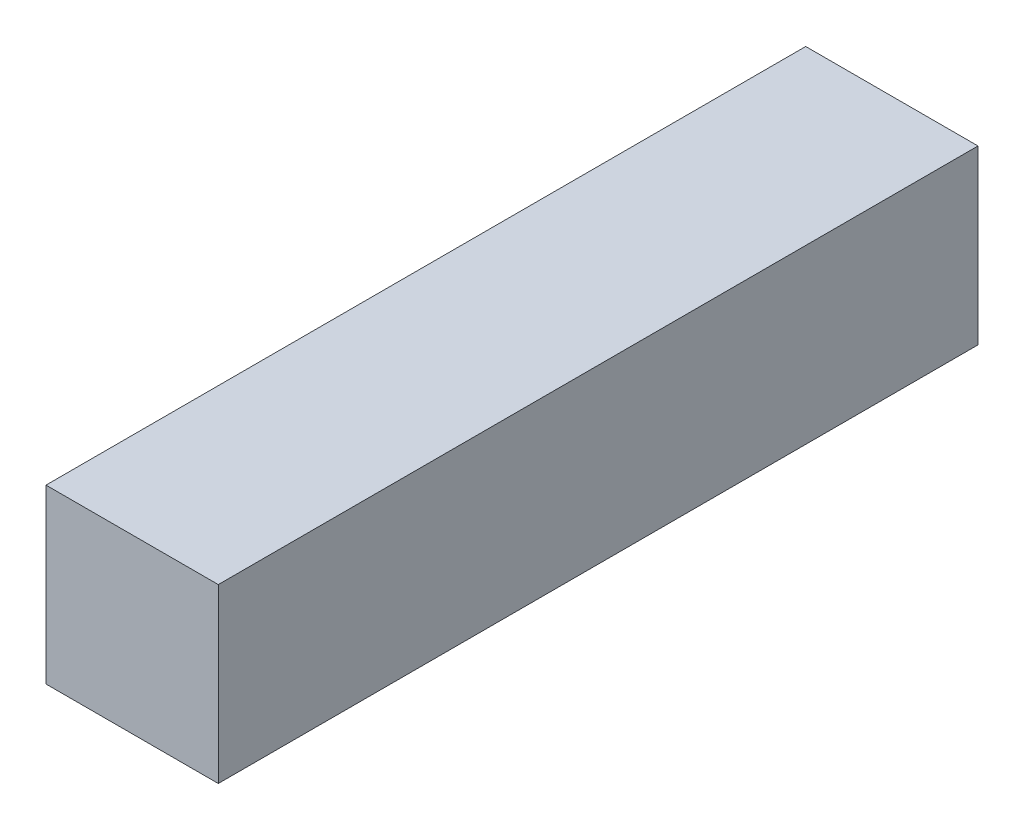
ISO-10303-21;
HEADER;
FILE_DESCRIPTION(('STEP AP214'),'2;1');
FILE_NAME('part.step','',(''),(''),'','','');
FILE_SCHEMA(('AUTOMOTIVE_DESIGN { 1 0 10303 214 1 1 1 1 }'));
ENDSEC;
DATA;
#1=APPLICATION_CONTEXT('core data for automotive mechanical design processes');
#2=APPLICATION_PROTOCOL_DEFINITION('international standard','automotive_design',2000,#1);
#3=PRODUCT_CONTEXT('',#1,'mechanical');
#4=PRODUCT('Part','Part','',(#3));
#5=PRODUCT_RELATED_PRODUCT_CATEGORY('part','',(#4));
#6=PRODUCT_DEFINITION_FORMATION('','',#4);
#7=PRODUCT_DEFINITION_CONTEXT('part definition',#1,'design');
#8=PRODUCT_DEFINITION('design','',#6,#7);
#9=PRODUCT_DEFINITION_SHAPE('','',#8);
#10=(LENGTH_UNIT() NAMED_UNIT(*) SI_UNIT(.MILLI.,.METRE.));
#11=(NAMED_UNIT(*) PLANE_ANGLE_UNIT() SI_UNIT($,.RADIAN.));
#12=(NAMED_UNIT(*) SI_UNIT($,.STERADIAN.) SOLID_ANGLE_UNIT());
#13=UNCERTAINTY_MEASURE_WITH_UNIT(LENGTH_MEASURE(1.E-05),#10,'distance_accuracy_value','');
#14=(GEOMETRIC_REPRESENTATION_CONTEXT(3) GLOBAL_UNCERTAINTY_ASSIGNED_CONTEXT((#13)) GLOBAL_UNIT_ASSIGNED_CONTEXT((#10,
#11,#12)) REPRESENTATION_CONTEXT('',''));
#15=CARTESIAN_POINT('',(0.,0.,0.));
#16=DIRECTION('',(0.,0.,1.));
#17=DIRECTION('',(1.,0.,0.));
#18=AXIS2_PLACEMENT_3D('',#15,#16,#17);
#19=CARTESIAN_POINT('',(2.38125,2.38125,-304.8));
#20=DIRECTION('',(1.,0.,0.));
#21=DIRECTION('',(0.,1.,0.));
#22=AXIS2_PLACEMENT_3D('',#19,#20,#21);
#23=PLANE('',#22);
#24=DIRECTION('',(0.,1.,0.));
#25=VECTOR('',#24,1.);
#26=CARTESIAN_POINT('',(2.38125,-2.38125,-304.8));
#27=LINE('',#26,#25);
#28=CARTESIAN_POINT('',(2.38125,-2.38125,-304.8));
#29=VERTEX_POINT('',#28);
#30=CARTESIAN_POINT('',(2.38125,2.38125,-304.8));
#31=VERTEX_POINT('',#30);
#32=EDGE_CURVE('E55',#29,#31,#27,.T.);
#33=ORIENTED_EDGE('',*,*,#32,.T.);
#34=DIRECTION('',(0.,0.,1.));
#35=VECTOR('',#34,1.);
#36=CARTESIAN_POINT('',(2.38125,2.38125,-304.8));
#37=LINE('',#36,#35);
#38=CARTESIAN_POINT('',(2.38125,2.38125,-283.8));
#39=VERTEX_POINT('',#38);
#40=EDGE_CURVE('E67',#39,#31,#37,.F.);
#41=ORIENTED_EDGE('',*,*,#40,.F.);
#42=DIRECTION('',(0.,1.,0.));
#43=VECTOR('',#42,1.);
#44=CARTESIAN_POINT('',(2.38125,-2.38125,-283.8));
#45=LINE('',#44,#43);
#46=CARTESIAN_POINT('',(2.38125,-2.38125,-283.8));
#47=VERTEX_POINT('',#46);
#48=EDGE_CURVE('E20',#47,#39,#45,.T.);
#49=ORIENTED_EDGE('',*,*,#48,.F.);
#50=DIRECTION('',(0.,0.,-1.));
#51=VECTOR('',#50,1.);
#52=CARTESIAN_POINT('',(2.38125,-2.38125,-304.8));
#53=LINE('',#52,#51);
#54=EDGE_CURVE('E81',#29,#47,#53,.F.);
#55=ORIENTED_EDGE('',*,*,#54,.F.);
#56=EDGE_LOOP('',(#33,#41,#49,#55));
#57=FACE_BOUND('',#56,.T.);
#58=ADVANCED_FACE('F17',(#57),#23,.T.);
#59=CARTESIAN_POINT('',(-2.38125,-2.38125,-283.8));
#60=DIRECTION('',(0.,0.,1.));
#61=DIRECTION('',(1.,0.,0.));
#62=AXIS2_PLACEMENT_3D('',#59,#60,#61);
#63=PLANE('',#62);
#64=ORIENTED_EDGE('',*,*,#48,.T.);
#65=DIRECTION('',(1.,0.,0.));
#66=VECTOR('',#65,1.);
#67=CARTESIAN_POINT('',(-2.38125,2.38125,-283.8));
#68=LINE('',#67,#66);
#69=CARTESIAN_POINT('',(-2.38125,2.38125,-283.8));
#70=VERTEX_POINT('',#69);
#71=EDGE_CURVE('E62',#70,#39,#68,.T.);
#72=ORIENTED_EDGE('',*,*,#71,.F.);
#73=DIRECTION('',(0.,1.,0.));
#74=VECTOR('',#73,1.);
#75=CARTESIAN_POINT('',(-2.38125,2.38125,-283.8));
#76=LINE('',#75,#74);
#77=CARTESIAN_POINT('',(-2.38125,-2.38125,-283.8));
#78=VERTEX_POINT('',#77);
#79=EDGE_CURVE('E83',#78,#70,#76,.T.);
#80=ORIENTED_EDGE('',*,*,#79,.F.);
#81=DIRECTION('',(1.,0.,0.));
#82=VECTOR('',#81,1.);
#83=CARTESIAN_POINT('',(-2.38125,-2.38125,-283.8));
#84=LINE('',#83,#82);
#85=EDGE_CURVE('E65',#47,#78,#84,.F.);
#86=ORIENTED_EDGE('',*,*,#85,.F.);
#87=EDGE_LOOP('',(#64,#72,#80,#86));
#88=FACE_BOUND('',#87,.T.);
#89=ADVANCED_FACE('F60',(#88),#63,.T.);
#90=CARTESIAN_POINT('',(-2.38125,2.38125,-304.8));
#91=DIRECTION('',(0.,1.,0.));
#92=DIRECTION('',(0.,0.,1.));
#93=AXIS2_PLACEMENT_3D('',#90,#91,#92);
#94=PLANE('',#93);
#95=DIRECTION('',(1.,0.,0.));
#96=VECTOR('',#95,1.);
#97=CARTESIAN_POINT('',(-2.38125,2.38125,-304.8));
#98=LINE('',#97,#96);
#99=CARTESIAN_POINT('',(-2.38125,2.38125,-304.8));
#100=VERTEX_POINT('',#99);
#101=EDGE_CURVE('E77',#31,#100,#98,.F.);
#102=ORIENTED_EDGE('',*,*,#101,.T.);
#103=DIRECTION('',(0.,0.,1.));
#104=VECTOR('',#103,1.);
#105=CARTESIAN_POINT('',(-2.38125,2.38125,-304.8));
#106=LINE('',#105,#104);
#107=EDGE_CURVE('E73',#70,#100,#106,.F.);
#108=ORIENTED_EDGE('',*,*,#107,.F.);
#109=ORIENTED_EDGE('',*,*,#71,.T.);
#110=ORIENTED_EDGE('',*,*,#40,.T.);
#111=EDGE_LOOP('',(#102,#108,#109,#110));
#112=FACE_BOUND('',#111,.T.);
#113=ADVANCED_FACE('F71',(#112),#94,.T.);
#114=CARTESIAN_POINT('',(-2.38125,-2.38125,-304.8));
#115=DIRECTION('',(0.,0.,1.));
#116=DIRECTION('',(1.,0.,0.));
#117=AXIS2_PLACEMENT_3D('',#114,#115,#116);
#118=PLANE('',#117);
#119=ORIENTED_EDGE('',*,*,#101,.F.);
#120=ORIENTED_EDGE('',*,*,#32,.F.);
#121=DIRECTION('',(1.,0.,0.));
#122=VECTOR('',#121,1.);
#123=CARTESIAN_POINT('',(-2.38125,-2.38125,-304.8));
#124=LINE('',#123,#122);
#125=CARTESIAN_POINT('',(-2.38125,-2.38125,-304.8));
#126=VERTEX_POINT('',#125);
#127=EDGE_CURVE('E35',#126,#29,#124,.T.);
#128=ORIENTED_EDGE('',*,*,#127,.F.);
#129=DIRECTION('',(0.,1.,0.));
#130=VECTOR('',#129,1.);
#131=CARTESIAN_POINT('',(-2.38125,2.38125,-304.8));
#132=LINE('',#131,#130);
#133=EDGE_CURVE('E26',#100,#126,#132,.F.);
#134=ORIENTED_EDGE('',*,*,#133,.F.);
#135=EDGE_LOOP('',(#119,#120,#128,#134));
#136=FACE_BOUND('',#135,.T.);
#137=ADVANCED_FACE('F89',(#136),#118,.F.);
#138=CARTESIAN_POINT('',(-2.38125,-2.38125,-304.8));
#139=DIRECTION('',(0.,-1.,0.));
#140=DIRECTION('',(0.,0.,-1.));
#141=AXIS2_PLACEMENT_3D('',#138,#139,#140);
#142=PLANE('',#141);
#143=ORIENTED_EDGE('',*,*,#127,.T.);
#144=ORIENTED_EDGE('',*,*,#54,.T.);
#145=ORIENTED_EDGE('',*,*,#85,.T.);
#146=DIRECTION('',(0.,0.,1.));
#147=VECTOR('',#146,1.);
#148=CARTESIAN_POINT('',(-2.38125,-2.38125,-304.8));
#149=LINE('',#148,#147);
#150=EDGE_CURVE('E11',#126,#78,#149,.T.);
#151=ORIENTED_EDGE('',*,*,#150,.F.);
#152=EDGE_LOOP('',(#143,#144,#145,#151));
#153=FACE_BOUND('',#152,.T.);
#154=ADVANCED_FACE('F91',(#153),#142,.T.);
#155=CARTESIAN_POINT('',(-2.38125,2.38125,-304.8));
#156=DIRECTION('',(-1.,0.,0.));
#157=DIRECTION('',(0.,0.,1.));
#158=AXIS2_PLACEMENT_3D('',#155,#156,#157);
#159=PLANE('',#158);
#160=ORIENTED_EDGE('',*,*,#133,.T.);
#161=ORIENTED_EDGE('',*,*,#150,.T.);
#162=ORIENTED_EDGE('',*,*,#79,.T.);
#163=ORIENTED_EDGE('',*,*,#107,.T.);
#164=EDGE_LOOP('',(#160,#161,#162,#163));
#165=FACE_BOUND('',#164,.T.);
#166=ADVANCED_FACE('F88',(#165),#159,.T.);
#167=CLOSED_SHELL('',(#58,#89,#113,#137,#154,#166));
#168=MANIFOLD_SOLID_BREP('B1',#167);
#169=ADVANCED_BREP_SHAPE_REPRESENTATION('',(#18,#168),#14);
#170=SHAPE_DEFINITION_REPRESENTATION(#9,#169);
ENDSEC;
END-ISO-10303-21;
